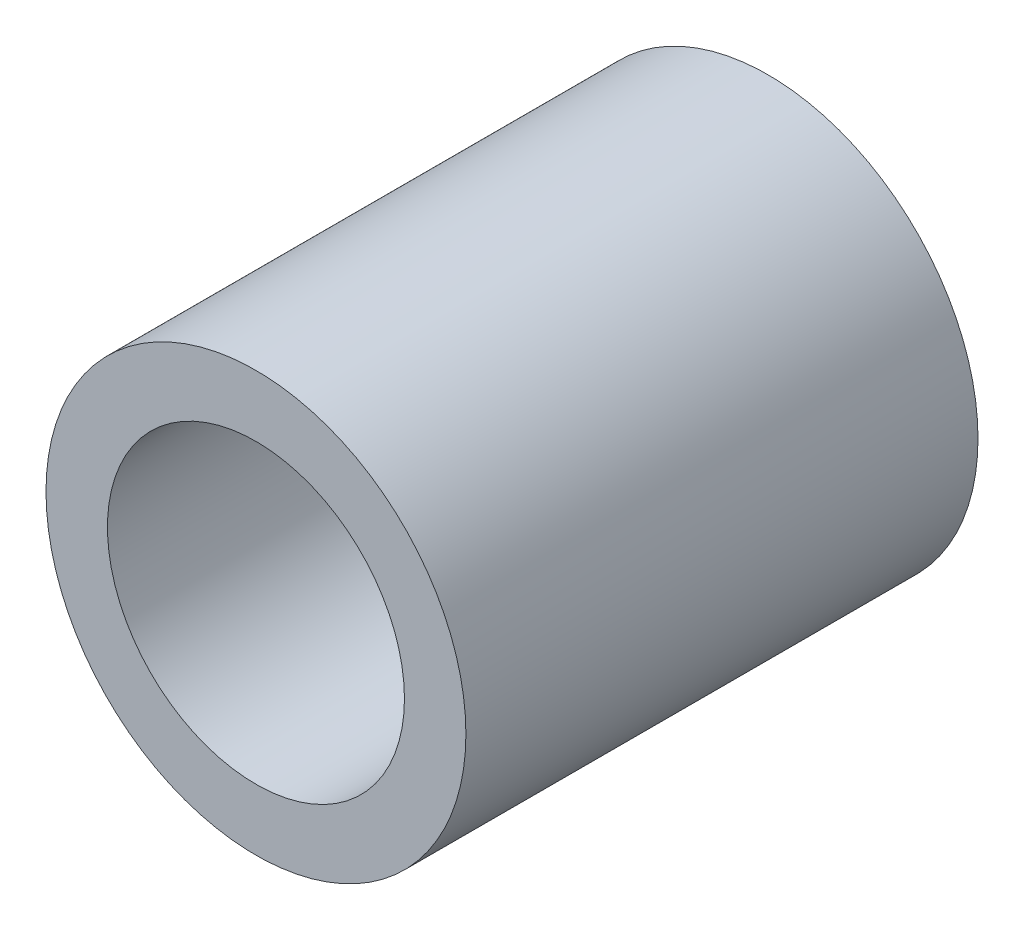
ISO-10303-21;
HEADER;
FILE_DESCRIPTION(('STEP AP214'),'2;1');
FILE_NAME('part.step','',(''),(''),'','','');
FILE_SCHEMA(('AUTOMOTIVE_DESIGN { 1 0 10303 214 1 1 1 1 }'));
ENDSEC;
DATA;
#1=APPLICATION_CONTEXT('core data for automotive mechanical design processes');
#2=APPLICATION_PROTOCOL_DEFINITION('international standard','automotive_design',2000,#1);
#3=PRODUCT_CONTEXT('',#1,'mechanical');
#4=PRODUCT('Part','Part','',(#3));
#5=PRODUCT_RELATED_PRODUCT_CATEGORY('part','',(#4));
#6=PRODUCT_DEFINITION_FORMATION('','',#4);
#7=PRODUCT_DEFINITION_CONTEXT('part definition',#1,'design');
#8=PRODUCT_DEFINITION('design','',#6,#7);
#9=PRODUCT_DEFINITION_SHAPE('','',#8);
#10=(LENGTH_UNIT() NAMED_UNIT(*) SI_UNIT(.MILLI.,.METRE.));
#11=(NAMED_UNIT(*) PLANE_ANGLE_UNIT() SI_UNIT($,.RADIAN.));
#12=(NAMED_UNIT(*) SI_UNIT($,.STERADIAN.) SOLID_ANGLE_UNIT());
#13=UNCERTAINTY_MEASURE_WITH_UNIT(LENGTH_MEASURE(1.E-05),#10,'distance_accuracy_value','');
#14=(GEOMETRIC_REPRESENTATION_CONTEXT(3) GLOBAL_UNCERTAINTY_ASSIGNED_CONTEXT((#13)) GLOBAL_UNIT_ASSIGNED_CONTEXT((#10,
#11,#12)) REPRESENTATION_CONTEXT('',''));
#15=CARTESIAN_POINT('',(0.,0.,0.));
#16=DIRECTION('',(0.,0.,1.));
#17=DIRECTION('',(1.,0.,0.));
#18=AXIS2_PLACEMENT_3D('',#15,#16,#17);
#19=CARTESIAN_POINT('',(0.,0.,5.));
#20=DIRECTION('',(0.,0.,1.));
#21=DIRECTION('',(1.,0.,0.));
#22=AXIS2_PLACEMENT_3D('',#19,#20,#21);
#23=PLANE('',#22);
#24=CARTESIAN_POINT('',(0.,0.,5.));
#25=DIRECTION('',(0.,0.,1.));
#26=DIRECTION('',(1.,0.,0.));
#27=AXIS2_PLACEMENT_3D('',#24,#25,#26);
#28=CIRCLE('',#27,2.05);
#29=CARTESIAN_POINT('',(2.05,0.,5.));
#30=VERTEX_POINT('',#29);
#31=EDGE_CURVE('E10',#30,#30,#28,.T.);
#32=ORIENTED_EDGE('',*,*,#31,.T.);
#33=EDGE_LOOP('',(#32));
#34=FACE_BOUND('',#33,.T.);
#35=CARTESIAN_POINT('',(0.,0.,5.));
#36=DIRECTION('',(0.,0.,1.));
#37=DIRECTION('',(1.,0.,0.));
#38=AXIS2_PLACEMENT_3D('',#35,#36,#37);
#39=CIRCLE('',#38,1.45);
#40=CARTESIAN_POINT('',(1.45,0.,5.));
#41=VERTEX_POINT('',#40);
#42=EDGE_CURVE('E42',#41,#41,#39,.T.);
#43=ORIENTED_EDGE('',*,*,#42,.F.);
#44=EDGE_LOOP('',(#43));
#45=FACE_BOUND('',#44,.T.);
#46=ADVANCED_FACE('F31',(#34,#45),#23,.T.);
#47=CARTESIAN_POINT('',(0.,0.,0.));
#48=DIRECTION('',(0.,0.,1.));
#49=DIRECTION('',(1.,0.,0.));
#50=AXIS2_PLACEMENT_3D('',#47,#48,#49);
#51=PLANE('',#50);
#52=CARTESIAN_POINT('',(0.,0.,0.));
#53=DIRECTION('',(0.,0.,1.));
#54=DIRECTION('',(1.,0.,0.));
#55=AXIS2_PLACEMENT_3D('',#52,#53,#54);
#56=CIRCLE('',#55,2.05);
#57=CARTESIAN_POINT('',(2.05,0.,0.));
#58=VERTEX_POINT('',#57);
#59=EDGE_CURVE('E35',#58,#58,#56,.T.);
#60=ORIENTED_EDGE('',*,*,#59,.F.);
#61=EDGE_LOOP('',(#60));
#62=FACE_BOUND('',#61,.T.);
#63=CARTESIAN_POINT('',(0.,0.,0.));
#64=DIRECTION('',(0.,0.,1.));
#65=DIRECTION('',(1.,0.,0.));
#66=AXIS2_PLACEMENT_3D('',#63,#64,#65);
#67=CIRCLE('',#66,1.45);
#68=CARTESIAN_POINT('',(1.45,0.,0.));
#69=VERTEX_POINT('',#68);
#70=EDGE_CURVE('E44',#69,#69,#67,.T.);
#71=ORIENTED_EDGE('',*,*,#70,.T.);
#72=EDGE_LOOP('',(#71));
#73=FACE_BOUND('',#72,.T.);
#74=ADVANCED_FACE('F54',(#62,#73),#51,.F.);
#75=CARTESIAN_POINT('',(0.,0.,5.));
#76=DIRECTION('',(0.,0.,-1.));
#77=DIRECTION('',(-1.,0.,0.));
#78=AXIS2_PLACEMENT_3D('',#75,#76,#77);
#79=CYLINDRICAL_SURFACE('',#78,2.05);
#80=ORIENTED_EDGE('',*,*,#31,.F.);
#81=EDGE_LOOP('',(#80));
#82=FACE_BOUND('',#81,.T.);
#83=ORIENTED_EDGE('',*,*,#59,.T.);
#84=EDGE_LOOP('',(#83));
#85=FACE_BOUND('',#84,.T.);
#86=ADVANCED_FACE('F33',(#82,#85),#79,.T.);
#87=CARTESIAN_POINT('',(0.,0.,5.));
#88=DIRECTION('',(0.,0.,-1.));
#89=DIRECTION('',(-1.,0.,0.));
#90=AXIS2_PLACEMENT_3D('',#87,#88,#89);
#91=CYLINDRICAL_SURFACE('',#90,1.45);
#92=ORIENTED_EDGE('',*,*,#42,.T.);
#93=EDGE_LOOP('',(#92));
#94=FACE_BOUND('',#93,.T.);
#95=ORIENTED_EDGE('',*,*,#70,.F.);
#96=EDGE_LOOP('',(#95));
#97=FACE_BOUND('',#96,.T.);
#98=ADVANCED_FACE('F50',(#94,#97),#91,.F.);
#99=CLOSED_SHELL('',(#46,#74,#86,#98));
#100=MANIFOLD_SOLID_BREP('B2',#99);
#101=ADVANCED_BREP_SHAPE_REPRESENTATION('',(#18,#100),#14);
#102=SHAPE_DEFINITION_REPRESENTATION(#9,#101);
ENDSEC;
END-ISO-10303-21;
